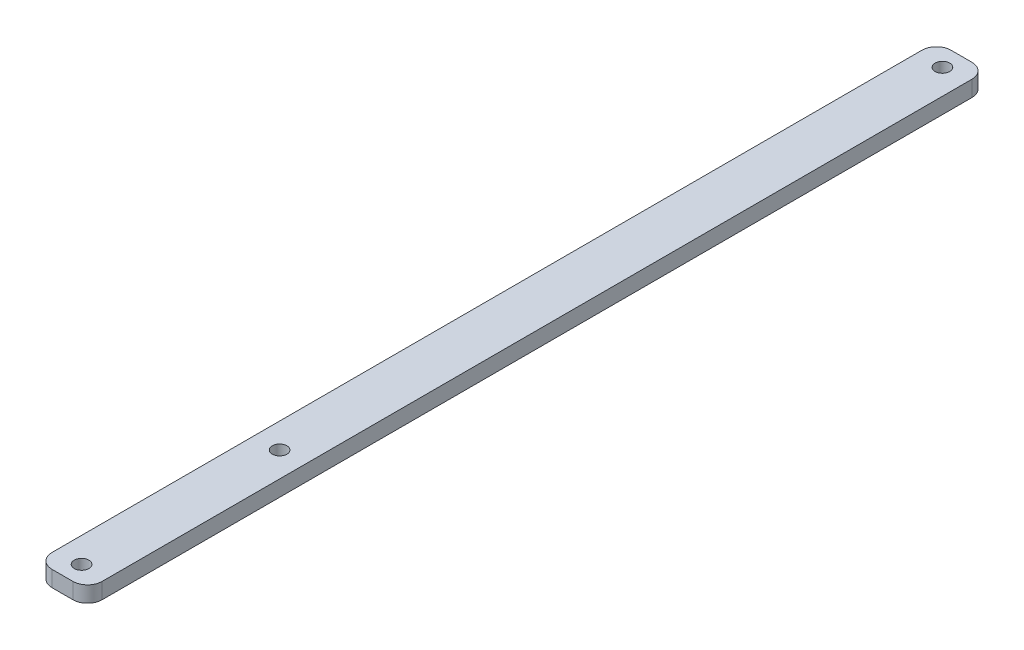
ISO-10303-21;
HEADER;
FILE_DESCRIPTION(('STEP AP214'),'2;1');
FILE_NAME('part.step','',(''),(''),'','','');
FILE_SCHEMA(('AUTOMOTIVE_DESIGN { 1 0 10303 214 1 1 1 1 }'));
ENDSEC;
DATA;
#1=APPLICATION_CONTEXT('core data for automotive mechanical design processes');
#2=APPLICATION_PROTOCOL_DEFINITION('international standard','automotive_design',2000,#1);
#3=PRODUCT_CONTEXT('',#1,'mechanical');
#4=PRODUCT('Part','Part','',(#3));
#5=PRODUCT_RELATED_PRODUCT_CATEGORY('part','',(#4));
#6=PRODUCT_DEFINITION_FORMATION('','',#4);
#7=PRODUCT_DEFINITION_CONTEXT('part definition',#1,'design');
#8=PRODUCT_DEFINITION('design','',#6,#7);
#9=PRODUCT_DEFINITION_SHAPE('','',#8);
#10=(LENGTH_UNIT() NAMED_UNIT(*) SI_UNIT(.MILLI.,.METRE.));
#11=(NAMED_UNIT(*) PLANE_ANGLE_UNIT() SI_UNIT($,.RADIAN.));
#12=(NAMED_UNIT(*) SI_UNIT($,.STERADIAN.) SOLID_ANGLE_UNIT());
#13=UNCERTAINTY_MEASURE_WITH_UNIT(LENGTH_MEASURE(1.E-05),#10,'distance_accuracy_value','');
#14=(GEOMETRIC_REPRESENTATION_CONTEXT(3) GLOBAL_UNCERTAINTY_ASSIGNED_CONTEXT((#13)) GLOBAL_UNIT_ASSIGNED_CONTEXT((#10,
#11,#12)) REPRESENTATION_CONTEXT('',''));
#15=CARTESIAN_POINT('',(0.,0.,0.));
#16=DIRECTION('',(0.,0.,1.));
#17=DIRECTION('',(1.,0.,0.));
#18=AXIS2_PLACEMENT_3D('',#15,#16,#17);
#19=CARTESIAN_POINT('',(0.,3.175,0.));
#20=DIRECTION('',(0.,1.,0.));
#21=DIRECTION('',(0.,0.,1.));
#22=AXIS2_PLACEMENT_3D('',#19,#20,#21);
#23=PLANE('',#22);
#24=CARTESIAN_POINT('',(0.,3.175,46.345));
#25=DIRECTION('',(0.,1.,0.));
#26=DIRECTION('',(0.,0.,1.));
#27=AXIS2_PLACEMENT_3D('',#24,#25,#26);
#28=CIRCLE('',#27,1.4605);
#29=CARTESIAN_POINT('',(0.,3.175,47.8055));
#30=VERTEX_POINT('',#29);
#31=EDGE_CURVE('E186',#30,#30,#28,.T.);
#32=ORIENTED_EDGE('',*,*,#31,.F.);
#33=EDGE_LOOP('',(#32));
#34=FACE_BOUND('',#33,.T.);
#35=DIRECTION('',(0.,0.,-1.));
#36=VECTOR('',#35,1.);
#37=CARTESIAN_POINT('',(4.99999999999998,3.175,-89.655));
#38=LINE('',#37,#36);
#39=CARTESIAN_POINT('',(5.,3.175,86.734));
#40=VERTEX_POINT('',#39);
#41=CARTESIAN_POINT('',(4.99999999999998,3.175,-86.734));
#42=VERTEX_POINT('',#41);
#43=EDGE_CURVE('E143',#40,#42,#38,.T.);
#44=ORIENTED_EDGE('',*,*,#43,.T.);
#45=CARTESIAN_POINT('',(2.07899999999998,3.175,-86.734));
#46=DIRECTION('',(0.,1.,0.));
#47=DIRECTION('',(0.,0.,1.));
#48=AXIS2_PLACEMENT_3D('',#45,#46,#47);
#49=CIRCLE('',#48,2.921);
#50=CARTESIAN_POINT('',(2.07899999999998,3.175,-89.655));
#51=VERTEX_POINT('',#50);
#52=EDGE_CURVE('E158',#42,#51,#49,.T.);
#53=ORIENTED_EDGE('',*,*,#52,.T.);
#54=DIRECTION('',(-1.,0.,0.));
#55=VECTOR('',#54,1.);
#56=CARTESIAN_POINT('',(-5.00000000000002,3.175,-89.655));
#57=LINE('',#56,#55);
#58=CARTESIAN_POINT('',(-2.07900000000002,3.175,-89.655));
#59=VERTEX_POINT('',#58);
#60=EDGE_CURVE('E125',#51,#59,#57,.T.);
#61=ORIENTED_EDGE('',*,*,#60,.T.);
#62=CARTESIAN_POINT('',(-2.07900000000002,3.175,-86.734));
#63=DIRECTION('',(0.,1.,0.));
#64=DIRECTION('',(0.,0.,1.));
#65=AXIS2_PLACEMENT_3D('',#62,#63,#64);
#66=CIRCLE('',#65,2.921);
#67=CARTESIAN_POINT('',(-5.00000000000002,3.175,-86.734));
#68=VERTEX_POINT('',#67);
#69=EDGE_CURVE('E156',#59,#68,#66,.T.);
#70=ORIENTED_EDGE('',*,*,#69,.T.);
#71=DIRECTION('',(0.,0.,1.));
#72=VECTOR('',#71,1.);
#73=CARTESIAN_POINT('',(-5.00000000000002,3.175,-89.655));
#74=LINE('',#73,#72);
#75=CARTESIAN_POINT('',(-5.,3.175,86.734));
#76=VERTEX_POINT('',#75);
#77=EDGE_CURVE('E169',#68,#76,#74,.T.);
#78=ORIENTED_EDGE('',*,*,#77,.T.);
#79=CARTESIAN_POINT('',(-2.079,3.175,86.734));
#80=DIRECTION('',(0.,1.,0.));
#81=DIRECTION('',(0.,0.,1.));
#82=AXIS2_PLACEMENT_3D('',#79,#80,#81);
#83=CIRCLE('',#82,2.921);
#84=CARTESIAN_POINT('',(-2.079,3.175,89.655));
#85=VERTEX_POINT('',#84);
#86=EDGE_CURVE('E60',#76,#85,#83,.T.);
#87=ORIENTED_EDGE('',*,*,#86,.T.);
#88=DIRECTION('',(1.,0.,0.));
#89=VECTOR('',#88,1.);
#90=CARTESIAN_POINT('',(-5.,3.175,89.655));
#91=LINE('',#90,#89);
#92=CARTESIAN_POINT('',(2.079,3.175,89.655));
#93=VERTEX_POINT('',#92);
#94=EDGE_CURVE('E144',#85,#93,#91,.T.);
#95=ORIENTED_EDGE('',*,*,#94,.T.);
#96=CARTESIAN_POINT('',(2.079,3.175,86.734));
#97=DIRECTION('',(0.,1.,0.));
#98=DIRECTION('',(0.,0.,1.));
#99=AXIS2_PLACEMENT_3D('',#96,#97,#98);
#100=CIRCLE('',#99,2.921);
#101=EDGE_CURVE('E153',#93,#40,#100,.T.);
#102=ORIENTED_EDGE('',*,*,#101,.T.);
#103=EDGE_LOOP('',(#44,#53,#61,#70,#78,#87,#95,#102));
#104=FACE_BOUND('',#103,.T.);
#105=CARTESIAN_POINT('',(0.,3.175,-85.845));
#106=DIRECTION('',(0.,1.,0.));
#107=DIRECTION('',(0.,0.,1.));
#108=AXIS2_PLACEMENT_3D('',#105,#106,#107);
#109=CIRCLE('',#108,1.4605);
#110=CARTESIAN_POINT('',(0.,3.175,-84.3845));
#111=VERTEX_POINT('',#110);
#112=EDGE_CURVE('E138',#111,#111,#109,.T.);
#113=ORIENTED_EDGE('',*,*,#112,.F.);
#114=EDGE_LOOP('',(#113));
#115=FACE_BOUND('',#114,.T.);
#116=CARTESIAN_POINT('',(0.,3.175,85.845));
#117=DIRECTION('',(0.,1.,0.));
#118=DIRECTION('',(0.,0.,1.));
#119=AXIS2_PLACEMENT_3D('',#116,#117,#118);
#120=CIRCLE('',#119,1.4605);
#121=CARTESIAN_POINT('',(0.,3.175,87.3055));
#122=VERTEX_POINT('',#121);
#123=EDGE_CURVE('E192',#122,#122,#120,.T.);
#124=ORIENTED_EDGE('',*,*,#123,.F.);
#125=EDGE_LOOP('',(#124));
#126=FACE_BOUND('',#125,.T.);
#127=ADVANCED_FACE('F39',(#34,#104,#115,#126),#23,.T.);
#128=CARTESIAN_POINT('',(0.,0.,0.));
#129=DIRECTION('',(0.,1.,0.));
#130=DIRECTION('',(0.,0.,1.));
#131=AXIS2_PLACEMENT_3D('',#128,#129,#130);
#132=PLANE('',#131);
#133=DIRECTION('',(-1.,0.,0.));
#134=VECTOR('',#133,1.);
#135=CARTESIAN_POINT('',(-5.00000000000002,0.,-89.655));
#136=LINE('',#135,#134);
#137=CARTESIAN_POINT('',(2.07899999999998,0.,-89.655));
#138=VERTEX_POINT('',#137);
#139=CARTESIAN_POINT('',(-2.07900000000002,0.,-89.655));
#140=VERTEX_POINT('',#139);
#141=EDGE_CURVE('E122',#138,#140,#136,.T.);
#142=ORIENTED_EDGE('',*,*,#141,.F.);
#143=CARTESIAN_POINT('',(2.07899999999998,0.,-86.734));
#144=DIRECTION('',(0.,1.,0.));
#145=DIRECTION('',(0.,0.,1.));
#146=AXIS2_PLACEMENT_3D('',#143,#144,#145);
#147=CIRCLE('',#146,2.921);
#148=CARTESIAN_POINT('',(4.99999999999998,0.,-86.734));
#149=VERTEX_POINT('',#148);
#150=EDGE_CURVE('E105',#138,#149,#147,.F.);
#151=ORIENTED_EDGE('',*,*,#150,.T.);
#152=DIRECTION('',(0.,0.,-1.));
#153=VECTOR('',#152,1.);
#154=CARTESIAN_POINT('',(4.99999999999998,0.,-89.655));
#155=LINE('',#154,#153);
#156=CARTESIAN_POINT('',(5.,0.,86.734));
#157=VERTEX_POINT('',#156);
#158=EDGE_CURVE('E133',#157,#149,#155,.T.);
#159=ORIENTED_EDGE('',*,*,#158,.F.);
#160=CARTESIAN_POINT('',(2.079,0.,86.734));
#161=DIRECTION('',(0.,1.,0.));
#162=DIRECTION('',(0.,0.,1.));
#163=AXIS2_PLACEMENT_3D('',#160,#161,#162);
#164=CIRCLE('',#163,2.921);
#165=CARTESIAN_POINT('',(2.079,0.,89.655));
#166=VERTEX_POINT('',#165);
#167=EDGE_CURVE('E126',#157,#166,#164,.F.);
#168=ORIENTED_EDGE('',*,*,#167,.T.);
#169=DIRECTION('',(1.,0.,0.));
#170=VECTOR('',#169,1.);
#171=CARTESIAN_POINT('',(-5.,0.,89.655));
#172=LINE('',#171,#170);
#173=CARTESIAN_POINT('',(-2.079,0.,89.655));
#174=VERTEX_POINT('',#173);
#175=EDGE_CURVE('E136',#174,#166,#172,.T.);
#176=ORIENTED_EDGE('',*,*,#175,.F.);
#177=CARTESIAN_POINT('',(-2.079,0.,86.734));
#178=DIRECTION('',(0.,1.,0.));
#179=DIRECTION('',(0.,0.,1.));
#180=AXIS2_PLACEMENT_3D('',#177,#178,#179);
#181=CIRCLE('',#180,2.921);
#182=CARTESIAN_POINT('',(-5.,0.,86.734));
#183=VERTEX_POINT('',#182);
#184=EDGE_CURVE('E147',#174,#183,#181,.F.);
#185=ORIENTED_EDGE('',*,*,#184,.T.);
#186=DIRECTION('',(0.,0.,1.));
#187=VECTOR('',#186,1.);
#188=CARTESIAN_POINT('',(-5.00000000000002,0.,-89.655));
#189=LINE('',#188,#187);
#190=CARTESIAN_POINT('',(-5.00000000000002,0.,-86.734));
#191=VERTEX_POINT('',#190);
#192=EDGE_CURVE('E132',#191,#183,#189,.T.);
#193=ORIENTED_EDGE('',*,*,#192,.F.);
#194=CARTESIAN_POINT('',(-2.07900000000002,0.,-86.734));
#195=DIRECTION('',(0.,1.,0.));
#196=DIRECTION('',(0.,0.,1.));
#197=AXIS2_PLACEMENT_3D('',#194,#195,#196);
#198=CIRCLE('',#197,2.921);
#199=EDGE_CURVE('E116',#191,#140,#198,.F.);
#200=ORIENTED_EDGE('',*,*,#199,.T.);
#201=EDGE_LOOP('',(#142,#151,#159,#168,#176,#185,#193,#200));
#202=FACE_BOUND('',#201,.T.);
#203=CARTESIAN_POINT('',(0.,0.,-85.845));
#204=DIRECTION('',(0.,1.,0.));
#205=DIRECTION('',(0.,0.,1.));
#206=AXIS2_PLACEMENT_3D('',#203,#204,#205);
#207=CIRCLE('',#206,1.4605);
#208=CARTESIAN_POINT('',(0.,0.,-84.3845));
#209=VERTEX_POINT('',#208);
#210=EDGE_CURVE('E183',#209,#209,#207,.T.);
#211=ORIENTED_EDGE('',*,*,#210,.T.);
#212=EDGE_LOOP('',(#211));
#213=FACE_BOUND('',#212,.T.);
#214=CARTESIAN_POINT('',(0.,0.,46.345));
#215=DIRECTION('',(0.,1.,0.));
#216=DIRECTION('',(0.,0.,1.));
#217=AXIS2_PLACEMENT_3D('',#214,#215,#216);
#218=CIRCLE('',#217,1.4605);
#219=CARTESIAN_POINT('',(0.,0.,47.8055));
#220=VERTEX_POINT('',#219);
#221=EDGE_CURVE('E189',#220,#220,#218,.T.);
#222=ORIENTED_EDGE('',*,*,#221,.T.);
#223=EDGE_LOOP('',(#222));
#224=FACE_BOUND('',#223,.T.);
#225=CARTESIAN_POINT('',(0.,0.,85.845));
#226=DIRECTION('',(0.,1.,0.));
#227=DIRECTION('',(0.,0.,1.));
#228=AXIS2_PLACEMENT_3D('',#225,#226,#227);
#229=CIRCLE('',#228,1.4605);
#230=CARTESIAN_POINT('',(0.,0.,87.3055));
#231=VERTEX_POINT('',#230);
#232=EDGE_CURVE('E195',#231,#231,#229,.T.);
#233=ORIENTED_EDGE('',*,*,#232,.T.);
#234=EDGE_LOOP('',(#233));
#235=FACE_BOUND('',#234,.T.);
#236=ADVANCED_FACE('F129',(#202,#213,#224,#235),#132,.F.);
#237=CARTESIAN_POINT('',(4.99999999999998,3.175,-89.655));
#238=DIRECTION('',(-1.,0.,0.));
#239=DIRECTION('',(0.,0.,1.));
#240=AXIS2_PLACEMENT_3D('',#237,#238,#239);
#241=PLANE('',#240);
#242=ORIENTED_EDGE('',*,*,#158,.T.);
#243=DIRECTION('',(0.,-1.,0.));
#244=VECTOR('',#243,1.);
#245=CARTESIAN_POINT('',(4.99999999999998,3.175,-86.734));
#246=LINE('',#245,#244);
#247=EDGE_CURVE('E110',#149,#42,#246,.F.);
#248=ORIENTED_EDGE('',*,*,#247,.T.);
#249=ORIENTED_EDGE('',*,*,#43,.F.);
#250=DIRECTION('',(0.,-1.,0.));
#251=VECTOR('',#250,1.);
#252=CARTESIAN_POINT('',(5.,3.175,86.734));
#253=LINE('',#252,#251);
#254=EDGE_CURVE('E115',#40,#157,#253,.T.);
#255=ORIENTED_EDGE('',*,*,#254,.T.);
#256=EDGE_LOOP('',(#242,#248,#249,#255));
#257=FACE_BOUND('',#256,.T.);
#258=ADVANCED_FACE('F210',(#257),#241,.F.);
#259=CARTESIAN_POINT('',(-5.00000000000002,3.175,-89.655));
#260=DIRECTION('',(0.,0.,1.));
#261=DIRECTION('',(1.,0.,0.));
#262=AXIS2_PLACEMENT_3D('',#259,#260,#261);
#263=PLANE('',#262);
#264=ORIENTED_EDGE('',*,*,#60,.F.);
#265=DIRECTION('',(0.,-1.,0.));
#266=VECTOR('',#265,1.);
#267=CARTESIAN_POINT('',(2.07899999999998,3.175,-89.655));
#268=LINE('',#267,#266);
#269=EDGE_CURVE('E109',#51,#138,#268,.T.);
#270=ORIENTED_EDGE('',*,*,#269,.T.);
#271=ORIENTED_EDGE('',*,*,#141,.T.);
#272=DIRECTION('',(0.,-1.,0.));
#273=VECTOR('',#272,1.);
#274=CARTESIAN_POINT('',(-2.07900000000002,3.175,-89.655));
#275=LINE('',#274,#273);
#276=EDGE_CURVE('E127',#140,#59,#275,.F.);
#277=ORIENTED_EDGE('',*,*,#276,.T.);
#278=EDGE_LOOP('',(#264,#270,#271,#277));
#279=FACE_BOUND('',#278,.T.);
#280=ADVANCED_FACE('F121',(#279),#263,.F.);
#281=CARTESIAN_POINT('',(-5.00000000000002,3.175,-89.655));
#282=DIRECTION('',(1.,0.,0.));
#283=DIRECTION('',(0.,0.,-1.));
#284=AXIS2_PLACEMENT_3D('',#281,#282,#283);
#285=PLANE('',#284);
#286=ORIENTED_EDGE('',*,*,#77,.F.);
#287=DIRECTION('',(0.,-1.,0.));
#288=VECTOR('',#287,1.);
#289=CARTESIAN_POINT('',(-5.00000000000002,3.175,-86.734));
#290=LINE('',#289,#288);
#291=EDGE_CURVE('E162',#68,#191,#290,.T.);
#292=ORIENTED_EDGE('',*,*,#291,.T.);
#293=ORIENTED_EDGE('',*,*,#192,.T.);
#294=DIRECTION('',(0.,-1.,0.));
#295=VECTOR('',#294,1.);
#296=CARTESIAN_POINT('',(-5.,3.175,86.734));
#297=LINE('',#296,#295);
#298=EDGE_CURVE('E160',#183,#76,#297,.F.);
#299=ORIENTED_EDGE('',*,*,#298,.T.);
#300=EDGE_LOOP('',(#286,#292,#293,#299));
#301=FACE_BOUND('',#300,.T.);
#302=ADVANCED_FACE('F167',(#301),#285,.F.);
#303=CARTESIAN_POINT('',(-5.,3.175,89.655));
#304=DIRECTION('',(0.,0.,-1.));
#305=DIRECTION('',(-1.,0.,0.));
#306=AXIS2_PLACEMENT_3D('',#303,#304,#305);
#307=PLANE('',#306);
#308=ORIENTED_EDGE('',*,*,#94,.F.);
#309=DIRECTION('',(0.,-1.,0.));
#310=VECTOR('',#309,1.);
#311=CARTESIAN_POINT('',(-2.079,3.175,89.655));
#312=LINE('',#311,#310);
#313=EDGE_CURVE('E11',#85,#174,#312,.T.);
#314=ORIENTED_EDGE('',*,*,#313,.T.);
#315=ORIENTED_EDGE('',*,*,#175,.T.);
#316=DIRECTION('',(0.,-1.,0.));
#317=VECTOR('',#316,1.);
#318=CARTESIAN_POINT('',(2.079,3.175,89.655));
#319=LINE('',#318,#317);
#320=EDGE_CURVE('E47',#166,#93,#319,.F.);
#321=ORIENTED_EDGE('',*,*,#320,.T.);
#322=EDGE_LOOP('',(#308,#314,#315,#321));
#323=FACE_BOUND('',#322,.T.);
#324=ADVANCED_FACE('F176',(#323),#307,.F.);
#325=CARTESIAN_POINT('',(0.,3.175,-85.845));
#326=DIRECTION('',(0.,-1.,0.));
#327=DIRECTION('',(0.,0.,-1.));
#328=AXIS2_PLACEMENT_3D('',#325,#326,#327);
#329=CYLINDRICAL_SURFACE('',#328,1.4605);
#330=ORIENTED_EDGE('',*,*,#112,.T.);
#331=EDGE_LOOP('',(#330));
#332=FACE_BOUND('',#331,.T.);
#333=ORIENTED_EDGE('',*,*,#210,.F.);
#334=EDGE_LOOP('',(#333));
#335=FACE_BOUND('',#334,.T.);
#336=ADVANCED_FACE('F214',(#332,#335),#329,.F.);
#337=CARTESIAN_POINT('',(0.,3.175,46.345));
#338=DIRECTION('',(0.,-1.,0.));
#339=DIRECTION('',(0.,0.,-1.));
#340=AXIS2_PLACEMENT_3D('',#337,#338,#339);
#341=CYLINDRICAL_SURFACE('',#340,1.4605);
#342=ORIENTED_EDGE('',*,*,#31,.T.);
#343=EDGE_LOOP('',(#342));
#344=FACE_BOUND('',#343,.T.);
#345=ORIENTED_EDGE('',*,*,#221,.F.);
#346=EDGE_LOOP('',(#345));
#347=FACE_BOUND('',#346,.T.);
#348=ADVANCED_FACE('F244',(#344,#347),#341,.F.);
#349=CARTESIAN_POINT('',(0.,3.175,85.845));
#350=DIRECTION('',(0.,-1.,0.));
#351=DIRECTION('',(0.,0.,-1.));
#352=AXIS2_PLACEMENT_3D('',#349,#350,#351);
#353=CYLINDRICAL_SURFACE('',#352,1.4605);
#354=ORIENTED_EDGE('',*,*,#123,.T.);
#355=EDGE_LOOP('',(#354));
#356=FACE_BOUND('',#355,.T.);
#357=ORIENTED_EDGE('',*,*,#232,.F.);
#358=EDGE_LOOP('',(#357));
#359=FACE_BOUND('',#358,.T.);
#360=ADVANCED_FACE('F201',(#356,#359),#353,.F.);
#361=CARTESIAN_POINT('',(2.07899999999998,3.175,-86.734));
#362=DIRECTION('',(0.,-1.,0.));
#363=DIRECTION('',(0.,0.,-1.));
#364=AXIS2_PLACEMENT_3D('',#361,#362,#363);
#365=CYLINDRICAL_SURFACE('',#364,2.921);
#366=ORIENTED_EDGE('',*,*,#52,.F.);
#367=ORIENTED_EDGE('',*,*,#247,.F.);
#368=ORIENTED_EDGE('',*,*,#150,.F.);
#369=ORIENTED_EDGE('',*,*,#269,.F.);
#370=EDGE_LOOP('',(#366,#367,#368,#369));
#371=FACE_BOUND('',#370,.T.);
#372=ADVANCED_FACE('F108',(#371),#365,.T.);
#373=CARTESIAN_POINT('',(-2.07900000000002,3.175,-86.734));
#374=DIRECTION('',(0.,-1.,0.));
#375=DIRECTION('',(0.,0.,-1.));
#376=AXIS2_PLACEMENT_3D('',#373,#374,#375);
#377=CYLINDRICAL_SURFACE('',#376,2.921);
#378=ORIENTED_EDGE('',*,*,#69,.F.);
#379=ORIENTED_EDGE('',*,*,#276,.F.);
#380=ORIENTED_EDGE('',*,*,#199,.F.);
#381=ORIENTED_EDGE('',*,*,#291,.F.);
#382=EDGE_LOOP('',(#378,#379,#380,#381));
#383=FACE_BOUND('',#382,.T.);
#384=ADVANCED_FACE('F228',(#383),#377,.T.);
#385=CARTESIAN_POINT('',(-2.079,3.175,86.734));
#386=DIRECTION('',(0.,-1.,0.));
#387=DIRECTION('',(0.,0.,-1.));
#388=AXIS2_PLACEMENT_3D('',#385,#386,#387);
#389=CYLINDRICAL_SURFACE('',#388,2.921);
#390=ORIENTED_EDGE('',*,*,#86,.F.);
#391=ORIENTED_EDGE('',*,*,#298,.F.);
#392=ORIENTED_EDGE('',*,*,#184,.F.);
#393=ORIENTED_EDGE('',*,*,#313,.F.);
#394=EDGE_LOOP('',(#390,#391,#392,#393));
#395=FACE_BOUND('',#394,.T.);
#396=ADVANCED_FACE('F175',(#395),#389,.T.);
#397=CARTESIAN_POINT('',(2.079,3.175,86.734));
#398=DIRECTION('',(0.,-1.,0.));
#399=DIRECTION('',(0.,0.,-1.));
#400=AXIS2_PLACEMENT_3D('',#397,#398,#399);
#401=CYLINDRICAL_SURFACE('',#400,2.921);
#402=ORIENTED_EDGE('',*,*,#101,.F.);
#403=ORIENTED_EDGE('',*,*,#320,.F.);
#404=ORIENTED_EDGE('',*,*,#167,.F.);
#405=ORIENTED_EDGE('',*,*,#254,.F.);
#406=EDGE_LOOP('',(#402,#403,#404,#405));
#407=FACE_BOUND('',#406,.T.);
#408=ADVANCED_FACE('F41',(#407),#401,.T.);
#409=CLOSED_SHELL('',(#127,#236,#258,#280,#302,#324,#336,#348,#360,#372,#384,#396,#408));
#410=MANIFOLD_SOLID_BREP('B2',#409);
#411=ADVANCED_BREP_SHAPE_REPRESENTATION('',(#18,#410),#14);
#412=SHAPE_DEFINITION_REPRESENTATION(#9,#411);
ENDSEC;
END-ISO-10303-21;
